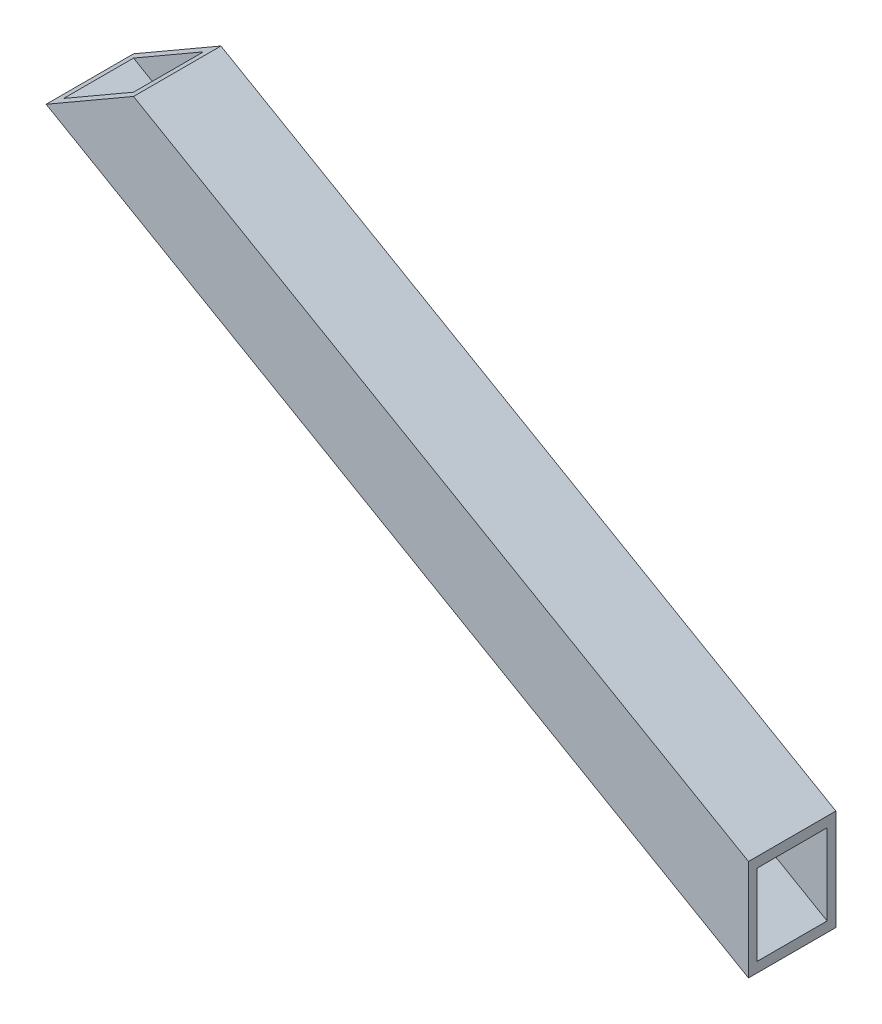
ISO-10303-21;
HEADER;
FILE_DESCRIPTION(('STEP AP214'),'2;1');
FILE_NAME('part.step','',(''),(''),'','','');
FILE_SCHEMA(('AUTOMOTIVE_DESIGN { 1 0 10303 214 1 1 1 1 }'));
ENDSEC;
DATA;
#1=APPLICATION_CONTEXT('core data for automotive mechanical design processes');
#2=APPLICATION_PROTOCOL_DEFINITION('international standard','automotive_design',2000,#1);
#3=PRODUCT_CONTEXT('',#1,'mechanical');
#4=PRODUCT('Part','Part','',(#3));
#5=PRODUCT_RELATED_PRODUCT_CATEGORY('part','',(#4));
#6=PRODUCT_DEFINITION_FORMATION('','',#4);
#7=PRODUCT_DEFINITION_CONTEXT('part definition',#1,'design');
#8=PRODUCT_DEFINITION('design','',#6,#7);
#9=PRODUCT_DEFINITION_SHAPE('','',#8);
#10=(LENGTH_UNIT() NAMED_UNIT(*) SI_UNIT(.MILLI.,.METRE.));
#11=(NAMED_UNIT(*) PLANE_ANGLE_UNIT() SI_UNIT($,.RADIAN.));
#12=(NAMED_UNIT(*) SI_UNIT($,.STERADIAN.) SOLID_ANGLE_UNIT());
#13=UNCERTAINTY_MEASURE_WITH_UNIT(LENGTH_MEASURE(1.E-05),#10,'distance_accuracy_value','');
#14=(GEOMETRIC_REPRESENTATION_CONTEXT(3) GLOBAL_UNCERTAINTY_ASSIGNED_CONTEXT((#13)) GLOBAL_UNIT_ASSIGNED_CONTEXT((#10,
#11,#12)) REPRESENTATION_CONTEXT('',''));
#15=CARTESIAN_POINT('',(0.,0.,0.));
#16=DIRECTION('',(0.,0.,1.));
#17=DIRECTION('',(1.,0.,0.));
#18=AXIS2_PLACEMENT_3D('',#15,#16,#17);
#19=CARTESIAN_POINT('',(-433124.409754782,249806.516306568,1808.3229528099));
#20=DIRECTION('',(0.500000000000017,0.866025403784429,0.));
#21=DIRECTION('',(-0.866025403784429,0.500000000000017,0.));
#22=AXIS2_PLACEMENT_3D('',#19,#20,#21);
#23=PLANE('',#22);
#24=DIRECTION('',(0.,0.,1.));
#25=VECTOR('',#24,1.);
#26=CARTESIAN_POINT('',(-223.41572498434,-128.989128960903,1828.8));
#27=LINE('',#26,#25);
#28=CARTESIAN_POINT('',(-223.41572498936,-128.989128980683,1828.8));
#29=VERTEX_POINT('',#28);
#30=CARTESIAN_POINT('',(-223.415724989374,-128.989128980683,1797.05));
#31=VERTEX_POINT('',#30);
#32=EDGE_CURVE('E110',#29,#31,#27,.F.);
#33=ORIENTED_EDGE('',*,*,#32,.F.);
#34=DIRECTION('',(-0.866025403784314,0.500000000000216,0.));
#35=VECTOR('',#34,1.);
#36=CARTESIAN_POINT('',(-8.18545231595635E-09,-257.978257922048,1828.8));
#37=LINE('',#36,#35);
#38=CARTESIAN_POINT('',(-1.06978835869124E-08,-257.978257928889,1828.8));
#39=VERTEX_POINT('',#38);
#40=EDGE_CURVE('E141',#39,#29,#37,.T.);
#41=ORIENTED_EDGE('',*,*,#40,.F.);
#42=DIRECTION('',(0.,0.,1.));
#43=VECTOR('',#42,1.);
#44=CARTESIAN_POINT('',(0.,-257.978257922056,1828.8));
#45=LINE('',#44,#43);
#46=CARTESIAN_POINT('',(-1.4523719705587E-08,-257.978257936169,1797.05));
#47=VERTEX_POINT('',#46);
#48=EDGE_CURVE('E132',#39,#47,#45,.F.);
#49=ORIENTED_EDGE('',*,*,#48,.T.);
#50=DIRECTION('',(-0.866025403784369,0.500000000000121,0.));
#51=VECTOR('',#50,1.);
#52=CARTESIAN_POINT('',(-8.18545231595635E-09,-257.978257922048,1797.05));
#53=LINE('',#52,#51);
#54=EDGE_CURVE('E113',#47,#31,#53,.T.);
#55=ORIENTED_EDGE('',*,*,#54,.T.);
#56=EDGE_LOOP('',(#33,#41,#49,#55));
#57=FACE_BOUND('',#56,.T.);
#58=ADVANCED_FACE('F16',(#57),#23,.T.);
#59=CARTESIAN_POINT('',(-433131.376315652,249794.449868851,1825.625));
#60=DIRECTION('',(0.,0.,1.));
#61=DIRECTION('',(1.,0.,0.));
#62=AXIS2_PLACEMENT_3D('',#59,#60,#61);
#63=PLANE('',#62);
#64=DIRECTION('',(-0.866025403784429,0.500000000000017,0.));
#65=VECTOR('',#64,1.);
#66=CARTESIAN_POINT('',(-433138.697254782,249781.769630661,1825.625));
#67=LINE('',#66,#65);
#68=CARTESIAN_POINT('',(-251.990724984132,-145.486912913494,1825.625));
#69=VERTEX_POINT('',#68);
#70=CARTESIAN_POINT('',(-8.97415475265007E-09,-290.973825811283,1825.625));
#71=VERTEX_POINT('',#70);
#72=EDGE_CURVE('E19',#69,#71,#67,.F.);
#73=ORIENTED_EDGE('',*,*,#72,.F.);
#74=DIRECTION('',(-0.866025403784429,-0.500000000000017,0.));
#75=VECTOR('',#74,1.);
#76=CARTESIAN_POINT('',(-127.58286248553,-73.66,1825.625));
#77=LINE('',#76,#75);
#78=CARTESIAN_POINT('',(-226.590724985974,-130.822216079769,1825.625));
#79=VERTEX_POINT('',#78);
#80=EDGE_CURVE('E104',#79,#69,#77,.T.);
#81=ORIENTED_EDGE('',*,*,#80,.F.);
#82=DIRECTION('',(-0.866025403784429,0.500000000000017,0.));
#83=VECTOR('',#82,1.);
#84=CARTESIAN_POINT('',(-433125.997254782,249803.766675923,1825.625));
#85=LINE('',#84,#83);
#86=CARTESIAN_POINT('',(-8.41979472535237E-09,-261.644432134035,1825.625));
#87=VERTEX_POINT('',#86);
#88=EDGE_CURVE('E99',#79,#87,#85,.F.);
#89=ORIENTED_EDGE('',*,*,#88,.T.);
#90=DIRECTION('',(0.,1.,0.));
#91=VECTOR('',#90,1.);
#92=CARTESIAN_POINT('',(0.,-147.32,1825.625));
#93=LINE('',#92,#91);
#94=EDGE_CURVE('E126',#87,#71,#93,.F.);
#95=ORIENTED_EDGE('',*,*,#94,.T.);
#96=EDGE_LOOP('',(#73,#81,#89,#95));
#97=FACE_BOUND('',#96,.T.);
#98=ADVANCED_FACE('F128',(#97),#63,.F.);
#99=CARTESIAN_POINT('',(-433138.697254782,249781.769630661,1808.3229528099));
#100=DIRECTION('',(0.500000000000017,0.866025403784429,0.));
#101=DIRECTION('',(-0.866025403784429,0.500000000000017,0.));
#102=AXIS2_PLACEMENT_3D('',#99,#100,#101);
#103=PLANE('',#102);
#104=DIRECTION('',(0.,0.,1.));
#105=VECTOR('',#104,1.);
#106=CARTESIAN_POINT('',(-251.990724983355,-145.486912902428,1828.8));
#107=LINE('',#106,#105);
#108=CARTESIAN_POINT('',(-251.990724984132,-145.486912913494,1800.225));
#109=VERTEX_POINT('',#108);
#110=EDGE_CURVE('E87',#69,#109,#107,.F.);
#111=ORIENTED_EDGE('',*,*,#110,.F.);
#112=ORIENTED_EDGE('',*,*,#72,.T.);
#113=DIRECTION('',(0.,0.,1.));
#114=VECTOR('',#113,1.);
#115=CARTESIAN_POINT('',(0.,-290.973825805058,1828.8));
#116=LINE('',#115,#114);
#117=CARTESIAN_POINT('',(-1.25339738588082E-08,-290.973825817511,1800.225));
#118=VERTEX_POINT('',#117);
#119=EDGE_CURVE('E121',#71,#118,#116,.F.);
#120=ORIENTED_EDGE('',*,*,#119,.T.);
#121=DIRECTION('',(0.866025403784326,-0.500000000000195,0.));
#122=VECTOR('',#121,1.);
#123=CARTESIAN_POINT('',(-251.990724979635,-145.486912908865,1800.225));
#124=LINE('',#123,#122);
#125=EDGE_CURVE('E100',#109,#118,#124,.T.);
#126=ORIENTED_EDGE('',*,*,#125,.F.);
#127=EDGE_LOOP('',(#111,#112,#120,#126));
#128=FACE_BOUND('',#127,.T.);
#129=ADVANCED_FACE('F120',(#128),#103,.T.);
#130=CARTESIAN_POINT('',(-433133.409284916,249790.928662965,1800.225));
#131=DIRECTION('',(0.,0.,1.));
#132=DIRECTION('',(1.,0.,0.));
#133=AXIS2_PLACEMENT_3D('',#130,#131,#132);
#134=PLANE('',#133);
#135=DIRECTION('',(-0.866025403784429,-0.500000000000017,0.));
#136=VECTOR('',#135,1.);
#137=CARTESIAN_POINT('',(-127.58286248553,-73.66,1800.225));
#138=LINE('',#137,#136);
#139=CARTESIAN_POINT('',(-226.590724982769,-130.822216074209,1800.225));
#140=VERTEX_POINT('',#139);
#141=EDGE_CURVE('E79',#109,#140,#138,.F.);
#142=ORIENTED_EDGE('',*,*,#141,.F.);
#143=ORIENTED_EDGE('',*,*,#125,.T.);
#144=DIRECTION('',(0.,1.,0.));
#145=VECTOR('',#144,1.);
#146=CARTESIAN_POINT('',(0.,-147.32,1800.225));
#147=LINE('',#146,#145);
#148=CARTESIAN_POINT('',(-8.42912746630063E-09,-261.644432134009,1800.225));
#149=VERTEX_POINT('',#148);
#150=EDGE_CURVE('E95',#118,#149,#147,.T.);
#151=ORIENTED_EDGE('',*,*,#150,.T.);
#152=DIRECTION('',(-0.866025403784429,0.500000000000017,0.));
#153=VECTOR('',#152,1.);
#154=CARTESIAN_POINT('',(-433125.997254782,249803.766675923,1800.225));
#155=LINE('',#154,#153);
#156=EDGE_CURVE('E92',#149,#140,#155,.T.);
#157=ORIENTED_EDGE('',*,*,#156,.T.);
#158=EDGE_LOOP('',(#142,#143,#151,#157));
#159=FACE_BOUND('',#158,.T.);
#160=ADVANCED_FACE('F93',(#159),#134,.T.);
#161=CARTESIAN_POINT('',(-433125.997254782,249803.766675923,1808.3229528099));
#162=DIRECTION('',(0.500000000000017,0.866025403784429,0.));
#163=DIRECTION('',(-0.866025403784429,0.500000000000017,0.));
#164=AXIS2_PLACEMENT_3D('',#161,#162,#163);
#165=PLANE('',#164);
#166=ORIENTED_EDGE('',*,*,#88,.F.);
#167=DIRECTION('',(0.,0.,1.));
#168=VECTOR('',#167,1.);
#169=CARTESIAN_POINT('',(-226.590724982112,-130.822216064294,1828.8));
#170=LINE('',#169,#168);
#171=EDGE_CURVE('E84',#140,#79,#170,.T.);
#172=ORIENTED_EDGE('',*,*,#171,.F.);
#173=ORIENTED_EDGE('',*,*,#156,.F.);
#174=DIRECTION('',(0.,0.,1.));
#175=VECTOR('',#174,1.);
#176=CARTESIAN_POINT('',(0.,-261.644432128682,1828.8));
#177=LINE('',#176,#175);
#178=EDGE_CURVE('E158',#149,#87,#177,.T.);
#179=ORIENTED_EDGE('',*,*,#178,.T.);
#180=EDGE_LOOP('',(#166,#172,#173,#179));
#181=FACE_BOUND('',#180,.T.);
#182=ADVANCED_FACE('F102',(#181),#165,.F.);
#183=CARTESIAN_POINT('',(-433133.409284916,249790.928662965,1797.05));
#184=DIRECTION('',(0.,0.,1.));
#185=DIRECTION('',(1.,0.,0.));
#186=AXIS2_PLACEMENT_3D('',#183,#184,#185);
#187=PLANE('',#186);
#188=DIRECTION('',(-0.866025403784429,0.500000000000017,0.));
#189=VECTOR('',#188,1.);
#190=CARTESIAN_POINT('',(-433140.284754782,249779.019999991,1797.05));
#191=LINE('',#190,#189);
#192=CARTESIAN_POINT('',(-1.1455669746141E-08,-294.640000025261,1797.05));
#193=VERTEX_POINT('',#192);
#194=CARTESIAN_POINT('',(-255.165724986975,-147.32000002264,1797.05));
#195=VERTEX_POINT('',#194);
#196=EDGE_CURVE('E155',#193,#195,#191,.T.);
#197=ORIENTED_EDGE('',*,*,#196,.T.);
#198=DIRECTION('',(-0.866025403784429,-0.500000000000017,0.));
#199=VECTOR('',#198,1.);
#200=CARTESIAN_POINT('',(-127.58286248553,-73.66,1797.05));
#201=LINE('',#200,#199);
#202=EDGE_CURVE('E89',#31,#195,#201,.T.);
#203=ORIENTED_EDGE('',*,*,#202,.F.);
#204=ORIENTED_EDGE('',*,*,#54,.F.);
#205=DIRECTION('',(0.,1.,0.));
#206=VECTOR('',#205,1.);
#207=CARTESIAN_POINT('',(0.,-147.32,1797.05));
#208=LINE('',#207,#206);
#209=EDGE_CURVE('E129',#47,#193,#208,.F.);
#210=ORIENTED_EDGE('',*,*,#209,.T.);
#211=EDGE_LOOP('',(#197,#203,#204,#210));
#212=FACE_BOUND('',#211,.T.);
#213=ADVANCED_FACE('F162',(#212),#187,.F.);
#214=CARTESIAN_POINT('',(-127.58286248553,-73.66,1828.8));
#215=DIRECTION('',(-0.500000000000017,0.866025403784429,0.));
#216=DIRECTION('',(-0.866025403784429,-0.500000000000017,0.));
#217=AXIS2_PLACEMENT_3D('',#214,#215,#216);
#218=PLANE('',#217);
#219=ORIENTED_EDGE('',*,*,#80,.T.);
#220=ORIENTED_EDGE('',*,*,#110,.T.);
#221=ORIENTED_EDGE('',*,*,#141,.T.);
#222=ORIENTED_EDGE('',*,*,#171,.T.);
#223=EDGE_LOOP('',(#219,#220,#221,#222));
#224=FACE_BOUND('',#223,.T.);
#225=DIRECTION('',(0.,0.,1.));
#226=VECTOR('',#225,1.);
#227=CARTESIAN_POINT('',(-255.165724999586,-147.320000048637,1808.3229528099));
#228=LINE('',#227,#226);
#229=CARTESIAN_POINT('',(-255.165724988142,-147.320000020617,1828.8));
#230=VERTEX_POINT('',#229);
#231=EDGE_CURVE('E152',#195,#230,#228,.T.);
#232=ORIENTED_EDGE('',*,*,#231,.T.);
#233=DIRECTION('',(-0.866025403772632,-0.50000000002045,0.));
#234=VECTOR('',#233,1.);
#235=CARTESIAN_POINT('',(-223.4157249801,-128.989128968243,1828.8));
#236=LINE('',#235,#234);
#237=EDGE_CURVE('E139',#29,#230,#236,.T.);
#238=ORIENTED_EDGE('',*,*,#237,.F.);
#239=ORIENTED_EDGE('',*,*,#32,.T.);
#240=ORIENTED_EDGE('',*,*,#202,.T.);
#241=EDGE_LOOP('',(#232,#238,#239,#240));
#242=FACE_BOUND('',#241,.T.);
#243=ADVANCED_FACE('F81',(#224,#242),#218,.T.);
#244=CARTESIAN_POINT('',(-433131.376315652,249794.449868851,1828.8));
#245=DIRECTION('',(0.,0.,1.));
#246=DIRECTION('',(1.,0.,0.));
#247=AXIS2_PLACEMENT_3D('',#244,#245,#246);
#248=PLANE('',#247);
#249=ORIENTED_EDGE('',*,*,#237,.T.);
#250=DIRECTION('',(-0.866025403784429,0.500000000000017,0.));
#251=VECTOR('',#250,1.);
#252=CARTESIAN_POINT('',(-433140.284754782,249779.019999991,1828.8));
#253=LINE('',#252,#251);
#254=CARTESIAN_POINT('',(-1.14478149182418E-08,-294.64000002528,1828.8));
#255=VERTEX_POINT('',#254);
#256=EDGE_CURVE('E25',#230,#255,#253,.F.);
#257=ORIENTED_EDGE('',*,*,#256,.T.);
#258=DIRECTION('',(0.,1.,0.));
#259=VECTOR('',#258,1.);
#260=CARTESIAN_POINT('',(0.,-147.32,1828.8));
#261=LINE('',#260,#259);
#262=EDGE_CURVE('E33',#255,#39,#261,.T.);
#263=ORIENTED_EDGE('',*,*,#262,.T.);
#264=ORIENTED_EDGE('',*,*,#40,.T.);
#265=EDGE_LOOP('',(#249,#257,#263,#264));
#266=FACE_BOUND('',#265,.T.);
#267=ADVANCED_FACE('F144',(#266),#248,.T.);
#268=CARTESIAN_POINT('',(0.,-147.32,1828.8));
#269=DIRECTION('',(-1.,0.,0.));
#270=DIRECTION('',(0.,0.,1.));
#271=AXIS2_PLACEMENT_3D('',#268,#269,#270);
#272=PLANE('',#271);
#273=ORIENTED_EDGE('',*,*,#150,.F.);
#274=ORIENTED_EDGE('',*,*,#119,.F.);
#275=ORIENTED_EDGE('',*,*,#94,.F.);
#276=ORIENTED_EDGE('',*,*,#178,.F.);
#277=EDGE_LOOP('',(#273,#274,#275,#276));
#278=FACE_BOUND('',#277,.T.);
#279=ORIENTED_EDGE('',*,*,#48,.F.);
#280=ORIENTED_EDGE('',*,*,#262,.F.);
#281=DIRECTION('',(0.,0.,1.));
#282=VECTOR('',#281,1.);
#283=CARTESIAN_POINT('',(-2.75690581474919E-08,-294.640000049213,1808.3229528099));
#284=LINE('',#283,#282);
#285=EDGE_CURVE('E11',#255,#193,#284,.F.);
#286=ORIENTED_EDGE('',*,*,#285,.T.);
#287=ORIENTED_EDGE('',*,*,#209,.F.);
#288=EDGE_LOOP('',(#279,#280,#286,#287));
#289=FACE_BOUND('',#288,.T.);
#290=ADVANCED_FACE('F125',(#278,#289),#272,.F.);
#291=CARTESIAN_POINT('',(-433140.284754782,249779.019999991,1808.3229528099));
#292=DIRECTION('',(0.500000000000017,0.866025403784429,0.));
#293=DIRECTION('',(-0.866025403784429,0.500000000000017,0.));
#294=AXIS2_PLACEMENT_3D('',#291,#292,#293);
#295=PLANE('',#294);
#296=ORIENTED_EDGE('',*,*,#256,.F.);
#297=ORIENTED_EDGE('',*,*,#231,.F.);
#298=ORIENTED_EDGE('',*,*,#196,.F.);
#299=ORIENTED_EDGE('',*,*,#285,.F.);
#300=EDGE_LOOP('',(#296,#297,#298,#299));
#301=FACE_BOUND('',#300,.T.);
#302=ADVANCED_FACE('F164',(#301),#295,.F.);
#303=CLOSED_SHELL('',(#58,#98,#129,#160,#182,#213,#243,#267,#290,#302));
#304=MANIFOLD_SOLID_BREP('B1',#303);
#305=ADVANCED_BREP_SHAPE_REPRESENTATION('',(#18,#304),#14);
#306=SHAPE_DEFINITION_REPRESENTATION(#9,#305);
ENDSEC;
END-ISO-10303-21;
